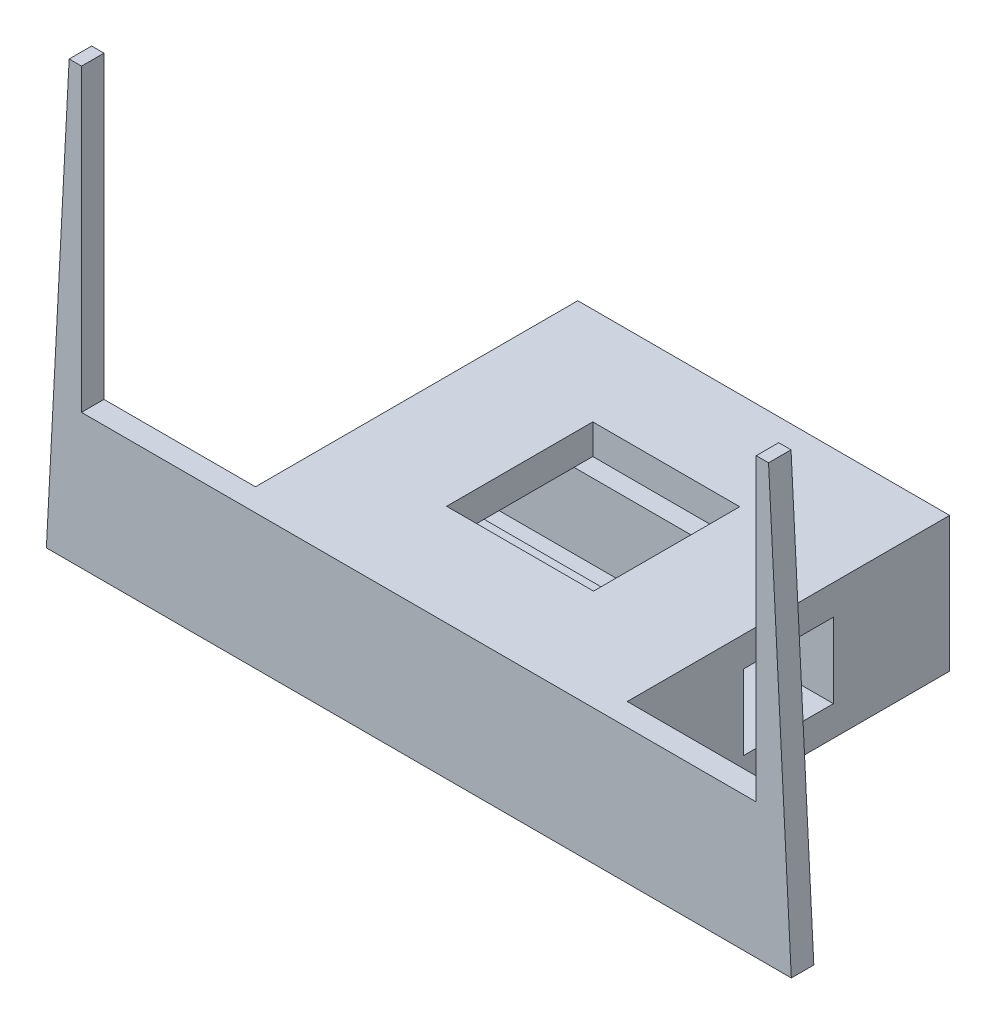
ISO-10303-21;
HEADER;
FILE_DESCRIPTION(('STEP AP214'),'2;1');
FILE_NAME('part.step','',(''),(''),'','','');
FILE_SCHEMA(('AUTOMOTIVE_DESIGN { 1 0 10303 214 1 1 1 1 }'));
ENDSEC;
DATA;
#1=APPLICATION_CONTEXT('core data for automotive mechanical design processes');
#2=APPLICATION_PROTOCOL_DEFINITION('international standard','automotive_design',2000,#1);
#3=PRODUCT_CONTEXT('',#1,'mechanical');
#4=PRODUCT('Part','Part','',(#3));
#5=PRODUCT_RELATED_PRODUCT_CATEGORY('part','',(#4));
#6=PRODUCT_DEFINITION_FORMATION('','',#4);
#7=PRODUCT_DEFINITION_CONTEXT('part definition',#1,'design');
#8=PRODUCT_DEFINITION('design','',#6,#7);
#9=PRODUCT_DEFINITION_SHAPE('','',#8);
#10=(LENGTH_UNIT() NAMED_UNIT(*) SI_UNIT(.MILLI.,.METRE.));
#11=(NAMED_UNIT(*) PLANE_ANGLE_UNIT() SI_UNIT($,.RADIAN.));
#12=(NAMED_UNIT(*) SI_UNIT($,.STERADIAN.) SOLID_ANGLE_UNIT());
#13=UNCERTAINTY_MEASURE_WITH_UNIT(LENGTH_MEASURE(1.E-05),#10,'distance_accuracy_value','');
#14=(GEOMETRIC_REPRESENTATION_CONTEXT(3) GLOBAL_UNCERTAINTY_ASSIGNED_CONTEXT((#13)) GLOBAL_UNIT_ASSIGNED_CONTEXT((#10,
#11,#12)) REPRESENTATION_CONTEXT('',''));
#15=CARTESIAN_POINT('',(0.,0.,0.));
#16=DIRECTION('',(0.,0.,1.));
#17=DIRECTION('',(1.,0.,0.));
#18=AXIS2_PLACEMENT_3D('',#15,#16,#17);
#19=CARTESIAN_POINT('',(-49.011468782096,126.446827243752,26.7908140059585));
#20=DIRECTION('',(1.,0.,0.));
#21=DIRECTION('',(0.,0.,-1.));
#22=AXIS2_PLACEMENT_3D('',#19,#20,#21);
#23=PLANE('',#22);
#24=DIRECTION('',(0.,1.,0.));
#25=VECTOR('',#24,1.);
#26=CARTESIAN_POINT('',(-49.011468782096,126.446827243752,-24.2091859940415));
#27=LINE('',#26,#25);
#28=CARTESIAN_POINT('',(-49.011468782096,-15.9745289935572,-24.2091859940415));
#29=VERTEX_POINT('',#28);
#30=CARTESIAN_POINT('',(-49.011468782096,24.0254710064428,-24.2091859940415));
#31=VERTEX_POINT('',#30);
#32=EDGE_CURVE('E244',#29,#31,#27,.T.);
#33=ORIENTED_EDGE('',*,*,#32,.F.);
#34=DIRECTION('',(0.,0.,-1.));
#35=VECTOR('',#34,1.);
#36=CARTESIAN_POINT('',(-49.011468782096,-15.9745289935572,-27.2091859940415));
#37=LINE('',#36,#35);
#38=CARTESIAN_POINT('',(-49.011468782096,-15.9745289935572,-27.2091859940415));
#39=VERTEX_POINT('',#38);
#40=EDGE_CURVE('E217',#29,#39,#37,.T.);
#41=ORIENTED_EDGE('',*,*,#40,.T.);
#42=DIRECTION('',(0.,-1.,0.));
#43=VECTOR('',#42,1.);
#44=CARTESIAN_POINT('',(-49.011468782096,24.0254710064428,-27.2091859940415));
#45=LINE('',#44,#43);
#46=CARTESIAN_POINT('',(-49.011468782096,24.0254710064428,-27.2091859940415));
#47=VERTEX_POINT('',#46);
#48=EDGE_CURVE('E328',#47,#39,#45,.T.);
#49=ORIENTED_EDGE('',*,*,#48,.F.);
#50=DIRECTION('',(0.,0.,1.));
#51=VECTOR('',#50,1.);
#52=CARTESIAN_POINT('',(-49.011468782096,24.0254710064428,-45.2091859940415));
#53=LINE('',#52,#51);
#54=EDGE_CURVE('E213',#47,#31,#53,.T.);
#55=ORIENTED_EDGE('',*,*,#54,.T.);
#56=EDGE_LOOP('',(#33,#41,#49,#55));
#57=FACE_BOUND('',#56,.T.);
#58=ADVANCED_FACE('F41',(#57),#23,.T.);
#59=CARTESIAN_POINT('',(40.988531217904,126.446827243752,26.7908140059585));
#60=DIRECTION('',(-1.,0.,0.));
#61=DIRECTION('',(0.,0.,1.));
#62=AXIS2_PLACEMENT_3D('',#59,#60,#61);
#63=PLANE('',#62);
#64=DIRECTION('',(0.,-1.,0.));
#65=VECTOR('',#64,1.);
#66=CARTESIAN_POINT('',(40.988531217904,126.446827243752,-24.2091859940415));
#67=LINE('',#66,#65);
#68=CARTESIAN_POINT('',(40.988531217904,24.0254710064428,-24.2091859940415));
#69=VERTEX_POINT('',#68);
#70=CARTESIAN_POINT('',(40.988531217904,-15.9745289935572,-24.2091859940415));
#71=VERTEX_POINT('',#70);
#72=EDGE_CURVE('E246',#69,#71,#67,.T.);
#73=ORIENTED_EDGE('',*,*,#72,.F.);
#74=DIRECTION('',(0.,0.,-1.));
#75=VECTOR('',#74,1.);
#76=CARTESIAN_POINT('',(40.988531217904,24.0254710064428,21.7908140059585));
#77=LINE('',#76,#75);
#78=CARTESIAN_POINT('',(40.988531217904,24.0254710064428,-27.2091859940415));
#79=VERTEX_POINT('',#78);
#80=EDGE_CURVE('E216',#69,#79,#77,.T.);
#81=ORIENTED_EDGE('',*,*,#80,.T.);
#82=DIRECTION('',(0.,1.,0.));
#83=VECTOR('',#82,1.);
#84=CARTESIAN_POINT('',(40.988531217904,-29.9745289935572,-27.2091859940415));
#85=LINE('',#84,#83);
#86=CARTESIAN_POINT('',(40.988531217904,-15.9745289935572,-27.2091859940415));
#87=VERTEX_POINT('',#86);
#88=EDGE_CURVE('E222',#87,#79,#85,.T.);
#89=ORIENTED_EDGE('',*,*,#88,.F.);
#90=DIRECTION('',(0.,0.,1.));
#91=VECTOR('',#90,1.);
#92=CARTESIAN_POINT('',(40.988531217904,-15.9745289935572,-27.2091859940415));
#93=LINE('',#92,#91);
#94=EDGE_CURVE('E210',#87,#71,#93,.T.);
#95=ORIENTED_EDGE('',*,*,#94,.T.);
#96=EDGE_LOOP('',(#73,#81,#89,#95));
#97=FACE_BOUND('',#96,.T.);
#98=ADVANCED_FACE('F386',(#97),#63,.T.);
#99=CARTESIAN_POINT('',(-39.011468782096,24.0254710064428,-45.2091859940415));
#100=DIRECTION('',(0.,1.,0.));
#101=DIRECTION('',(0.,0.,1.));
#102=AXIS2_PLACEMENT_3D('',#99,#100,#101);
#103=PLANE('',#102);
#104=DIRECTION('',(-1.,0.,0.));
#105=VECTOR('',#104,1.);
#106=CARTESIAN_POINT('',(-53.6970221063976,24.0254710064428,-24.2091859940415));
#107=LINE('',#106,#105);
#108=CARTESIAN_POINT('',(-50.6573709079813,24.0254710064428,-24.2091859940415));
#109=VERTEX_POINT('',#108);
#110=EDGE_CURVE('E52',#31,#109,#107,.T.);
#111=ORIENTED_EDGE('',*,*,#110,.F.);
#112=ORIENTED_EDGE('',*,*,#54,.F.);
#113=DIRECTION('',(1.,0.,0.));
#114=VECTOR('',#113,1.);
#115=CARTESIAN_POINT('',(-50.6573709079813,24.0254710064428,-27.2091859940415));
#116=LINE('',#115,#114);
#117=CARTESIAN_POINT('',(-50.6573709079813,24.0254710064428,-27.2091859940415));
#118=VERTEX_POINT('',#117);
#119=EDGE_CURVE('E355',#118,#47,#116,.T.);
#120=ORIENTED_EDGE('',*,*,#119,.F.);
#121=DIRECTION('',(0.,0.,1.));
#122=VECTOR('',#121,1.);
#123=CARTESIAN_POINT('',(-50.6573709079813,24.0254710064428,24.7908140059585));
#124=LINE('',#123,#122);
#125=EDGE_CURVE('E205',#118,#109,#124,.T.);
#126=ORIENTED_EDGE('',*,*,#125,.T.);
#127=EDGE_LOOP('',(#111,#112,#120,#126));
#128=FACE_BOUND('',#127,.T.);
#129=ADVANCED_FACE('F389',(#128),#103,.T.);
#130=CARTESIAN_POINT('',(42.6344333437893,24.0254710064428,-24.2091859940415));
#131=VERTEX_POINT('',#130);
#132=EDGE_CURVE('E11',#131,#69,#107,.T.);
#133=ORIENTED_EDGE('',*,*,#132,.F.);
#134=DIRECTION('',(0.,0.,-1.));
#135=VECTOR('',#134,1.);
#136=CARTESIAN_POINT('',(42.6344333437893,24.0254710064428,-45.2091859940415));
#137=LINE('',#136,#135);
#138=CARTESIAN_POINT('',(42.6344333437893,24.0254710064428,-27.2091859940415));
#139=VERTEX_POINT('',#138);
#140=EDGE_CURVE('E199',#131,#139,#137,.T.);
#141=ORIENTED_EDGE('',*,*,#140,.T.);
#142=DIRECTION('',(1.,0.,0.));
#143=VECTOR('',#142,1.);
#144=CARTESIAN_POINT('',(40.988531217904,24.0254710064428,-27.2091859940415));
#145=LINE('',#144,#143);
#146=EDGE_CURVE('E227',#79,#139,#145,.T.);
#147=ORIENTED_EDGE('',*,*,#146,.F.);
#148=ORIENTED_EDGE('',*,*,#80,.F.);
#149=EDGE_LOOP('',(#133,#141,#147,#148));
#150=FACE_BOUND('',#149,.T.);
#151=ADVANCED_FACE('F384',(#150),#103,.T.);
#152=CARTESIAN_POINT('',(-50.6573709079813,24.0254710064428,-45.2091859940415));
#153=DIRECTION('',(-0.998629534754574,0.0523359562429415,0.));
#154=DIRECTION('',(0.,0.,-1.));
#155=AXIS2_PLACEMENT_3D('',#152,#153,#154);
#156=PLANE('',#155);
#157=DIRECTION('',(-0.0523359562429415,-0.998629534754574,0.));
#158=VECTOR('',#157,1.);
#159=CARTESIAN_POINT('',(-50.6573709079813,24.0254710064428,-24.2091859940415));
#160=LINE('',#159,#158);
#161=CARTESIAN_POINT('',(-53.6970221063976,-33.9745289935572,-24.2091859940415));
#162=VERTEX_POINT('',#161);
#163=EDGE_CURVE('E184',#109,#162,#160,.T.);
#164=ORIENTED_EDGE('',*,*,#163,.F.);
#165=ORIENTED_EDGE('',*,*,#125,.F.);
#166=DIRECTION('',(0.0523359562429415,0.998629534754574,0.));
#167=VECTOR('',#166,1.);
#168=CARTESIAN_POINT('',(-53.6970221063976,-33.9745289935572,-27.2091859940415));
#169=LINE('',#168,#167);
#170=CARTESIAN_POINT('',(-53.6970221063976,-33.9745289935572,-27.2091859940415));
#171=VERTEX_POINT('',#170);
#172=EDGE_CURVE('E352',#171,#118,#169,.T.);
#173=ORIENTED_EDGE('',*,*,#172,.F.);
#174=DIRECTION('',(0.,0.,-1.));
#175=VECTOR('',#174,1.);
#176=CARTESIAN_POINT('',(-53.6970221063976,-33.9745289935572,-45.2091859940415));
#177=LINE('',#176,#175);
#178=EDGE_CURVE('E192',#162,#171,#177,.T.);
#179=ORIENTED_EDGE('',*,*,#178,.F.);
#180=EDGE_LOOP('',(#164,#165,#173,#179));
#181=FACE_BOUND('',#180,.T.);
#182=ADVANCED_FACE('F399',(#181),#156,.T.);
#183=CARTESIAN_POINT('',(42.6344333437893,24.0254710064428,-45.2091859940415));
#184=DIRECTION('',(0.998629534754574,0.0523359562429415,0.));
#185=DIRECTION('',(0.,0.,1.));
#186=AXIS2_PLACEMENT_3D('',#183,#184,#185);
#187=PLANE('',#186);
#188=DIRECTION('',(-0.0523359562429415,0.998629534754574,0.));
#189=VECTOR('',#188,1.);
#190=CARTESIAN_POINT('',(42.6344333437893,24.0254710064428,-24.2091859940415));
#191=LINE('',#190,#189);
#192=CARTESIAN_POINT('',(45.6740845422055,-33.9745289935572,-24.2091859940415));
#193=VERTEX_POINT('',#192);
#194=EDGE_CURVE('E50',#193,#131,#191,.T.);
#195=ORIENTED_EDGE('',*,*,#194,.F.);
#196=DIRECTION('',(0.,0.,1.));
#197=VECTOR('',#196,1.);
#198=CARTESIAN_POINT('',(45.6740845422055,-33.9745289935572,-45.2091859940415));
#199=LINE('',#198,#197);
#200=CARTESIAN_POINT('',(45.6740845422055,-33.9745289935572,-27.2091859940415));
#201=VERTEX_POINT('',#200);
#202=EDGE_CURVE('E44',#201,#193,#199,.T.);
#203=ORIENTED_EDGE('',*,*,#202,.F.);
#204=DIRECTION('',(0.0523359562429415,-0.998629534754574,0.));
#205=VECTOR('',#204,1.);
#206=CARTESIAN_POINT('',(42.6344333437893,24.0254710064428,-27.2091859940415));
#207=LINE('',#206,#205);
#208=EDGE_CURVE('E349',#139,#201,#207,.T.);
#209=ORIENTED_EDGE('',*,*,#208,.F.);
#210=ORIENTED_EDGE('',*,*,#140,.F.);
#211=EDGE_LOOP('',(#195,#203,#209,#210));
#212=FACE_BOUND('',#211,.T.);
#213=ADVANCED_FACE('F196',(#212),#187,.T.);
#214=CARTESIAN_POINT('',(-54.011468782096,-33.9745289935572,-50.2091859940415));
#215=DIRECTION('',(0.,1.,0.));
#216=DIRECTION('',(0.,0.,1.));
#217=AXIS2_PLACEMENT_3D('',#214,#215,#216);
#218=PLANE('',#217);
#219=ORIENTED_EDGE('',*,*,#202,.T.);
#220=DIRECTION('',(-1.,0.,0.));
#221=VECTOR('',#220,1.);
#222=CARTESIAN_POINT('',(-53.6970221063976,-33.9745289935572,-24.2091859940415));
#223=LINE('',#222,#221);
#224=EDGE_CURVE('E186',#193,#162,#223,.T.);
#225=ORIENTED_EDGE('',*,*,#224,.T.);
#226=ORIENTED_EDGE('',*,*,#178,.T.);
#227=DIRECTION('',(-1.,0.,0.));
#228=VECTOR('',#227,1.);
#229=CARTESIAN_POINT('',(45.6740845422055,-33.9745289935572,-27.2091859940415));
#230=LINE('',#229,#228);
#231=CARTESIAN_POINT('',(-28.811468782096,-33.9745289935572,-27.2091859940415));
#232=VERTEX_POINT('',#231);
#233=EDGE_CURVE('E240',#232,#171,#230,.T.);
#234=ORIENTED_EDGE('',*,*,#233,.F.);
#235=DIRECTION('',(0.,0.,1.));
#236=VECTOR('',#235,1.);
#237=CARTESIAN_POINT('',(-28.811468782096,-33.9745289935572,-70.2091859940415));
#238=LINE('',#237,#236);
#239=CARTESIAN_POINT('',(-28.811468782096,-33.9745289935572,-70.2091859940415));
#240=VERTEX_POINT('',#239);
#241=EDGE_CURVE('E310',#240,#232,#238,.T.);
#242=ORIENTED_EDGE('',*,*,#241,.F.);
#243=DIRECTION('',(-1.,0.,0.));
#244=VECTOR('',#243,1.);
#245=CARTESIAN_POINT('',(-54.011468782096,-33.9745289935572,-70.2091859940415));
#246=LINE('',#245,#244);
#247=CARTESIAN_POINT('',(20.788531217904,-33.9745289935572,-70.2091859940415));
#248=VERTEX_POINT('',#247);
#249=EDGE_CURVE('E236',#248,#240,#246,.T.);
#250=ORIENTED_EDGE('',*,*,#249,.F.);
#251=DIRECTION('',(0.,0.,-1.));
#252=VECTOR('',#251,1.);
#253=CARTESIAN_POINT('',(20.788531217904,-33.9745289935572,-70.2091859940415));
#254=LINE('',#253,#252);
#255=CARTESIAN_POINT('',(20.788531217904,-33.9745289935572,-27.2091859940415));
#256=VERTEX_POINT('',#255);
#257=EDGE_CURVE('E266',#256,#248,#254,.T.);
#258=ORIENTED_EDGE('',*,*,#257,.F.);
#259=EDGE_CURVE('E204',#201,#256,#230,.T.);
#260=ORIENTED_EDGE('',*,*,#259,.F.);
#261=EDGE_LOOP('',(#219,#225,#226,#234,#242,#250,#258,#260));
#262=FACE_BOUND('',#261,.T.);
#263=ADVANCED_FACE('F202',(#262),#218,.F.);
#264=CARTESIAN_POINT('',(-4.01146878209603,-39.9745289935572,-27.2091859940415));
#265=DIRECTION('',(0.,0.,-1.));
#266=DIRECTION('',(-1.,0.,0.));
#267=AXIS2_PLACEMENT_3D('',#264,#265,#266);
#268=PLANE('',#267);
#269=DIRECTION('',(1.,0.,0.));
#270=VECTOR('',#269,1.);
#271=CARTESIAN_POINT('',(40.988531217904,-15.9745289935572,-27.2091859940415));
#272=LINE('',#271,#270);
#273=CARTESIAN_POINT('',(20.7885312179039,-15.9745289935572,-27.2091859940415));
#274=VERTEX_POINT('',#273);
#275=EDGE_CURVE('E218',#274,#87,#272,.T.);
#276=ORIENTED_EDGE('',*,*,#275,.T.);
#277=ORIENTED_EDGE('',*,*,#88,.T.);
#278=ORIENTED_EDGE('',*,*,#146,.T.);
#279=ORIENTED_EDGE('',*,*,#208,.T.);
#280=ORIENTED_EDGE('',*,*,#259,.T.);
#281=DIRECTION('',(0.,1.,0.));
#282=VECTOR('',#281,1.);
#283=CARTESIAN_POINT('',(20.788531217904,-39.9745289935572,-27.2091859940415));
#284=LINE('',#283,#282);
#285=EDGE_CURVE('E241',#256,#274,#284,.T.);
#286=ORIENTED_EDGE('',*,*,#285,.T.);
#287=EDGE_LOOP('',(#276,#277,#278,#279,#280,#286));
#288=FACE_BOUND('',#287,.T.);
#289=ADVANCED_FACE('F382',(#288),#268,.T.);
#290=DIRECTION('',(1.,0.,0.));
#291=VECTOR('',#290,1.);
#292=CARTESIAN_POINT('',(-28.811468782096,-15.9745289935572,-27.2091859940415));
#293=LINE('',#292,#291);
#294=CARTESIAN_POINT('',(-28.811468782096,-15.9745289935572,-27.2091859940415));
#295=VERTEX_POINT('',#294);
#296=EDGE_CURVE('E237',#39,#295,#293,.T.);
#297=ORIENTED_EDGE('',*,*,#296,.T.);
#298=DIRECTION('',(0.,1.,0.));
#299=VECTOR('',#298,1.);
#300=CARTESIAN_POINT('',(-28.811468782096,-39.9745289935572,-27.2091859940415));
#301=LINE('',#300,#299);
#302=EDGE_CURVE('E260',#232,#295,#301,.T.);
#303=ORIENTED_EDGE('',*,*,#302,.F.);
#304=ORIENTED_EDGE('',*,*,#233,.T.);
#305=ORIENTED_EDGE('',*,*,#172,.T.);
#306=ORIENTED_EDGE('',*,*,#119,.T.);
#307=ORIENTED_EDGE('',*,*,#48,.T.);
#308=EDGE_LOOP('',(#297,#303,#304,#305,#306,#307));
#309=FACE_BOUND('',#308,.T.);
#310=ADVANCED_FACE('F362',(#309),#268,.T.);
#311=CARTESIAN_POINT('',(-28.811468782096,49.3008062076875,-57.2091859940415));
#312=DIRECTION('',(0.,0.,-1.));
#313=DIRECTION('',(-1.,0.,0.));
#314=AXIS2_PLACEMENT_3D('',#311,#312,#313);
#315=PLANE('',#314);
#316=DIRECTION('',(0.,1.,0.));
#317=VECTOR('',#316,1.);
#318=CARTESIAN_POINT('',(5.78853121790398,-19.9745289935572,-57.2091859940415));
#319=LINE('',#318,#317);
#320=CARTESIAN_POINT('',(5.78853121790398,-19.9745289935572,-57.2091859940415));
#321=VERTEX_POINT('',#320);
#322=CARTESIAN_POINT('',(5.78853121790398,-15.9745289935572,-57.2091859940415));
#323=VERTEX_POINT('',#322);
#324=EDGE_CURVE('E325',#321,#323,#319,.T.);
#325=ORIENTED_EDGE('',*,*,#324,.T.);
#326=DIRECTION('',(-1.,0.,0.));
#327=VECTOR('',#326,1.);
#328=CARTESIAN_POINT('',(-28.811468782096,-15.9745289935572,-57.2091859940415));
#329=LINE('',#328,#327);
#330=CARTESIAN_POINT('',(-13.811468782096,-15.9745289935572,-57.2091859940415));
#331=VERTEX_POINT('',#330);
#332=EDGE_CURVE('E324',#323,#331,#329,.T.);
#333=ORIENTED_EDGE('',*,*,#332,.T.);
#334=DIRECTION('',(0.,-1.,0.));
#335=VECTOR('',#334,1.);
#336=CARTESIAN_POINT('',(-13.811468782096,-14.9745289935572,-57.2091859940415));
#337=LINE('',#336,#335);
#338=CARTESIAN_POINT('',(-13.811468782096,-19.9745289935572,-57.2091859940415));
#339=VERTEX_POINT('',#338);
#340=EDGE_CURVE('E322',#331,#339,#337,.T.);
#341=ORIENTED_EDGE('',*,*,#340,.T.);
#342=DIRECTION('',(1.,0.,0.));
#343=VECTOR('',#342,1.);
#344=CARTESIAN_POINT('',(-13.811468782096,-19.9745289935572,-57.2091859940415));
#345=LINE('',#344,#343);
#346=EDGE_CURVE('E319',#339,#321,#345,.T.);
#347=ORIENTED_EDGE('',*,*,#346,.T.);
#348=EDGE_LOOP('',(#325,#333,#341,#347));
#349=FACE_BOUND('',#348,.T.);
#350=ADVANCED_FACE('F432',(#349),#315,.F.);
#351=CARTESIAN_POINT('',(-4.01146878209604,-19.9745289935572,-30.2091859940415));
#352=DIRECTION('',(0.,1.,0.));
#353=DIRECTION('',(0.,0.,1.));
#354=AXIS2_PLACEMENT_3D('',#351,#352,#353);
#355=PLANE('',#354);
#356=DIRECTION('',(0.,0.,1.));
#357=VECTOR('',#356,1.);
#358=CARTESIAN_POINT('',(5.78853121790398,-19.9745289935572,-59.7091859940415));
#359=LINE('',#358,#357);
#360=CARTESIAN_POINT('',(5.78853121790398,-19.9745289935572,-54.7091859940415));
#361=VERTEX_POINT('',#360);
#362=EDGE_CURVE('E315',#321,#361,#359,.T.);
#363=ORIENTED_EDGE('',*,*,#362,.F.);
#364=ORIENTED_EDGE('',*,*,#346,.F.);
#365=DIRECTION('',(0.,0.,-1.));
#366=VECTOR('',#365,1.);
#367=CARTESIAN_POINT('',(-13.811468782096,-19.9745289935572,-59.7091859940415));
#368=LINE('',#367,#366);
#369=CARTESIAN_POINT('',(-13.811468782096,-19.9745289935572,-54.7091859940415));
#370=VERTEX_POINT('',#369);
#371=EDGE_CURVE('E307',#370,#339,#368,.T.);
#372=ORIENTED_EDGE('',*,*,#371,.F.);
#373=DIRECTION('',(1.,0.,0.));
#374=VECTOR('',#373,1.);
#375=CARTESIAN_POINT('',(-28.811468782096,-19.9745289935572,-54.7091859940415));
#376=LINE('',#375,#374);
#377=EDGE_CURVE('E288',#370,#361,#376,.T.);
#378=ORIENTED_EDGE('',*,*,#377,.T.);
#379=EDGE_LOOP('',(#363,#364,#372,#378));
#380=FACE_BOUND('',#379,.T.);
#381=ADVANCED_FACE('F428',(#380),#355,.T.);
#382=CARTESIAN_POINT('',(-13.811468782096,-14.9745289935572,-59.7091859940415));
#383=DIRECTION('',(-1.,0.,0.));
#384=DIRECTION('',(0.,0.,1.));
#385=AXIS2_PLACEMENT_3D('',#382,#383,#384);
#386=PLANE('',#385);
#387=ORIENTED_EDGE('',*,*,#340,.F.);
#388=DIRECTION('',(0.,0.,1.));
#389=VECTOR('',#388,1.);
#390=CARTESIAN_POINT('',(-13.811468782096,-15.9745289935572,-59.7091859940415));
#391=LINE('',#390,#389);
#392=CARTESIAN_POINT('',(-13.811468782096,-15.9745289935572,-37.7091859940415));
#393=VERTEX_POINT('',#392);
#394=EDGE_CURVE('E303',#331,#393,#391,.T.);
#395=ORIENTED_EDGE('',*,*,#394,.T.);
#396=DIRECTION('',(0.,-1.,0.));
#397=VECTOR('',#396,1.);
#398=CARTESIAN_POINT('',(-13.811468782096,-14.9745289935572,-37.7091859940415));
#399=LINE('',#398,#397);
#400=CARTESIAN_POINT('',(-13.811468782096,-19.9745289935572,-37.7091859940415));
#401=VERTEX_POINT('',#400);
#402=EDGE_CURVE('E300',#393,#401,#399,.T.);
#403=ORIENTED_EDGE('',*,*,#402,.T.);
#404=CARTESIAN_POINT('',(-13.811468782096,-19.9745289935572,-42.7091859940415));
#405=VERTEX_POINT('',#404);
#406=EDGE_CURVE('E302',#401,#405,#368,.T.);
#407=ORIENTED_EDGE('',*,*,#406,.T.);
#408=EDGE_CURVE('E306',#405,#370,#368,.T.);
#409=ORIENTED_EDGE('',*,*,#408,.T.);
#410=ORIENTED_EDGE('',*,*,#371,.T.);
#411=EDGE_LOOP('',(#387,#395,#403,#407,#409,#410));
#412=FACE_BOUND('',#411,.T.);
#413=ADVANCED_FACE('F431',(#412),#386,.F.);
#414=CARTESIAN_POINT('',(5.78853121790398,-14.9745289935572,-59.7091859940415));
#415=DIRECTION('',(1.,0.,0.));
#416=DIRECTION('',(0.,0.,-1.));
#417=AXIS2_PLACEMENT_3D('',#414,#415,#416);
#418=PLANE('',#417);
#419=DIRECTION('',(0.,-1.,0.));
#420=VECTOR('',#419,1.);
#421=CARTESIAN_POINT('',(5.78853121790398,-14.9745289935572,-37.7091859940415));
#422=LINE('',#421,#420);
#423=CARTESIAN_POINT('',(5.78853121790398,-15.9745289935572,-37.7091859940415));
#424=VERTEX_POINT('',#423);
#425=CARTESIAN_POINT('',(5.78853121790398,-19.9745289935572,-37.7091859940415));
#426=VERTEX_POINT('',#425);
#427=EDGE_CURVE('E235',#424,#426,#422,.T.);
#428=ORIENTED_EDGE('',*,*,#427,.F.);
#429=DIRECTION('',(0.,0.,-1.));
#430=VECTOR('',#429,1.);
#431=CARTESIAN_POINT('',(5.78853121790398,-15.9745289935572,-59.7091859940415));
#432=LINE('',#431,#430);
#433=EDGE_CURVE('E317',#424,#323,#432,.T.);
#434=ORIENTED_EDGE('',*,*,#433,.T.);
#435=ORIENTED_EDGE('',*,*,#324,.F.);
#436=ORIENTED_EDGE('',*,*,#362,.T.);
#437=CARTESIAN_POINT('',(5.78853121790398,-19.9745289935572,-42.7091859940415));
#438=VERTEX_POINT('',#437);
#439=EDGE_CURVE('E316',#361,#438,#359,.T.);
#440=ORIENTED_EDGE('',*,*,#439,.T.);
#441=EDGE_CURVE('E292',#438,#426,#359,.T.);
#442=ORIENTED_EDGE('',*,*,#441,.T.);
#443=EDGE_LOOP('',(#428,#434,#435,#436,#440,#442));
#444=FACE_BOUND('',#443,.T.);
#445=ADVANCED_FACE('F437',(#444),#418,.F.);
#446=CARTESIAN_POINT('',(-4.01146878209604,-19.9745289935572,-30.2091859940415));
#447=DIRECTION('',(0.,1.,0.));
#448=DIRECTION('',(0.,0.,1.));
#449=AXIS2_PLACEMENT_3D('',#446,#447,#448);
#450=PLANE('',#449);
#451=DIRECTION('',(1.,0.,0.));
#452=VECTOR('',#451,1.);
#453=CARTESIAN_POINT('',(-28.811468782096,-19.9745289935572,-37.7091859940415));
#454=LINE('',#453,#452);
#455=EDGE_CURVE('E289',#401,#426,#454,.T.);
#456=ORIENTED_EDGE('',*,*,#455,.T.);
#457=ORIENTED_EDGE('',*,*,#441,.F.);
#458=DIRECTION('',(-1.,0.,0.));
#459=VECTOR('',#458,1.);
#460=CARTESIAN_POINT('',(-28.811468782096,-19.9745289935572,-42.7091859940415));
#461=LINE('',#460,#459);
#462=EDGE_CURVE('E291',#438,#405,#461,.T.);
#463=ORIENTED_EDGE('',*,*,#462,.T.);
#464=ORIENTED_EDGE('',*,*,#406,.F.);
#465=EDGE_LOOP('',(#456,#457,#463,#464));
#466=FACE_BOUND('',#465,.T.);
#467=ADVANCED_FACE('F434',(#466),#450,.T.);
#468=CARTESIAN_POINT('',(-39.011468782096,-29.9745289935572,-65.2091859940415));
#469=DIRECTION('',(0.,-1.,0.));
#470=DIRECTION('',(0.,0.,-1.));
#471=AXIS2_PLACEMENT_3D('',#468,#469,#470);
#472=PLANE('',#471);
#473=DIRECTION('',(-1.,0.,0.));
#474=VECTOR('',#473,1.);
#475=CARTESIAN_POINT('',(-28.811468782096,-29.9745289935572,-42.7091859940415));
#476=LINE('',#475,#474);
#477=CARTESIAN_POINT('',(20.788531217904,-29.9745289935572,-42.7091859940415));
#478=VERTEX_POINT('',#477);
#479=CARTESIAN_POINT('',(-28.811468782096,-29.9745289935572,-42.7091859940415));
#480=VERTEX_POINT('',#479);
#481=EDGE_CURVE('E278',#478,#480,#476,.T.);
#482=ORIENTED_EDGE('',*,*,#481,.F.);
#483=DIRECTION('',(0.,0.,1.));
#484=VECTOR('',#483,1.);
#485=CARTESIAN_POINT('',(20.788531217904,-29.9745289935572,-70.2091859940415));
#486=LINE('',#485,#484);
#487=CARTESIAN_POINT('',(20.788531217904,-29.9745289935572,-54.7091859940415));
#488=VERTEX_POINT('',#487);
#489=EDGE_CURVE('E257',#488,#478,#486,.T.);
#490=ORIENTED_EDGE('',*,*,#489,.F.);
#491=DIRECTION('',(1.,0.,0.));
#492=VECTOR('',#491,1.);
#493=CARTESIAN_POINT('',(-28.811468782096,-29.9745289935572,-54.7091859940415));
#494=LINE('',#493,#492);
#495=CARTESIAN_POINT('',(-28.811468782096,-29.9745289935572,-54.7091859940415));
#496=VERTEX_POINT('',#495);
#497=EDGE_CURVE('E273',#496,#488,#494,.T.);
#498=ORIENTED_EDGE('',*,*,#497,.F.);
#499=DIRECTION('',(0.,0.,-1.));
#500=VECTOR('',#499,1.);
#501=CARTESIAN_POINT('',(-28.811468782096,-29.9745289935572,-70.2091859940415));
#502=LINE('',#501,#500);
#503=EDGE_CURVE('E271',#480,#496,#502,.T.);
#504=ORIENTED_EDGE('',*,*,#503,.F.);
#505=EDGE_LOOP('',(#482,#490,#498,#504));
#506=FACE_BOUND('',#505,.T.);
#507=ADVANCED_FACE('F420',(#506),#472,.F.);
#508=CARTESIAN_POINT('',(20.788531217904,-39.9745289935572,-70.2091859940415));
#509=DIRECTION('',(-1.,0.,0.));
#510=DIRECTION('',(0.,0.,1.));
#511=AXIS2_PLACEMENT_3D('',#508,#509,#510);
#512=PLANE('',#511);
#513=DIRECTION('',(0.,0.,1.));
#514=VECTOR('',#513,1.);
#515=CARTESIAN_POINT('',(20.788531217904,-15.9745289935572,-70.2091859940415));
#516=LINE('',#515,#514);
#517=CARTESIAN_POINT('',(20.788531217904,-15.9745289935572,-70.2091859940415));
#518=VERTEX_POINT('',#517);
#519=EDGE_CURVE('E334',#518,#274,#516,.T.);
#520=ORIENTED_EDGE('',*,*,#519,.T.);
#521=ORIENTED_EDGE('',*,*,#285,.F.);
#522=ORIENTED_EDGE('',*,*,#257,.T.);
#523=DIRECTION('',(0.,1.,0.));
#524=VECTOR('',#523,1.);
#525=CARTESIAN_POINT('',(20.788531217904,-39.9745289935572,-70.2091859940415));
#526=LINE('',#525,#524);
#527=EDGE_CURVE('E262',#248,#518,#526,.T.);
#528=ORIENTED_EDGE('',*,*,#527,.T.);
#529=EDGE_LOOP('',(#520,#521,#522,#528));
#530=FACE_BOUND('',#529,.T.);
#531=DIRECTION('',(0.,0.,-1.));
#532=VECTOR('',#531,1.);
#533=CARTESIAN_POINT('',(20.788531217904,-19.9745289935572,-59.7091859940415));
#534=LINE('',#533,#532);
#535=CARTESIAN_POINT('',(20.788531217904,-19.9745289935572,-42.7091859940415));
#536=VERTEX_POINT('',#535);
#537=CARTESIAN_POINT('',(20.788531217904,-19.9745289935572,-54.7091859940415));
#538=VERTEX_POINT('',#537);
#539=EDGE_CURVE('E265',#536,#538,#534,.T.);
#540=ORIENTED_EDGE('',*,*,#539,.T.);
#541=DIRECTION('',(0.,-1.,0.));
#542=VECTOR('',#541,1.);
#543=CARTESIAN_POINT('',(20.788531217904,-19.9745289935572,-54.7091859940415));
#544=LINE('',#543,#542);
#545=EDGE_CURVE('E261',#538,#488,#544,.T.);
#546=ORIENTED_EDGE('',*,*,#545,.T.);
#547=ORIENTED_EDGE('',*,*,#489,.T.);
#548=DIRECTION('',(0.,-1.,0.));
#549=VECTOR('',#548,1.);
#550=CARTESIAN_POINT('',(20.788531217904,-19.9745289935572,-42.7091859940415));
#551=LINE('',#550,#549);
#552=EDGE_CURVE('E287',#536,#478,#551,.T.);
#553=ORIENTED_EDGE('',*,*,#552,.F.);
#554=EDGE_LOOP('',(#540,#546,#547,#553));
#555=FACE_BOUND('',#554,.T.);
#556=ADVANCED_FACE('F379',(#530,#555),#512,.F.);
#557=CARTESIAN_POINT('',(-28.811468782096,-39.9745289935572,-70.2091859940415));
#558=DIRECTION('',(1.,0.,0.));
#559=DIRECTION('',(0.,0.,-1.));
#560=AXIS2_PLACEMENT_3D('',#557,#558,#559);
#561=PLANE('',#560);
#562=ORIENTED_EDGE('',*,*,#302,.T.);
#563=DIRECTION('',(0.,0.,-1.));
#564=VECTOR('',#563,1.);
#565=CARTESIAN_POINT('',(-28.811468782096,-15.9745289935572,-70.2091859940415));
#566=LINE('',#565,#564);
#567=CARTESIAN_POINT('',(-28.8114687820961,-15.9745289935572,-70.2091859940415));
#568=VERTEX_POINT('',#567);
#569=EDGE_CURVE('E331',#295,#568,#566,.T.);
#570=ORIENTED_EDGE('',*,*,#569,.T.);
#571=DIRECTION('',(0.,1.,0.));
#572=VECTOR('',#571,1.);
#573=CARTESIAN_POINT('',(-28.811468782096,-39.9745289935572,-70.2091859940415));
#574=LINE('',#573,#572);
#575=EDGE_CURVE('E267',#240,#568,#574,.T.);
#576=ORIENTED_EDGE('',*,*,#575,.F.);
#577=ORIENTED_EDGE('',*,*,#241,.T.);
#578=EDGE_LOOP('',(#562,#570,#576,#577));
#579=FACE_BOUND('',#578,.T.);
#580=DIRECTION('',(0.,-1.,0.));
#581=VECTOR('',#580,1.);
#582=CARTESIAN_POINT('',(-28.811468782096,-19.9745289935572,-54.7091859940415));
#583=LINE('',#582,#581);
#584=CARTESIAN_POINT('',(-28.811468782096,-19.9745289935572,-54.7091859940415));
#585=VERTEX_POINT('',#584);
#586=EDGE_CURVE('E275',#585,#496,#583,.T.);
#587=ORIENTED_EDGE('',*,*,#586,.F.);
#588=DIRECTION('',(0.,0.,1.));
#589=VECTOR('',#588,1.);
#590=CARTESIAN_POINT('',(-28.811468782096,-19.9745289935572,-59.7091859940415));
#591=LINE('',#590,#589);
#592=CARTESIAN_POINT('',(-28.811468782096,-19.9745289935572,-42.7091859940415));
#593=VERTEX_POINT('',#592);
#594=EDGE_CURVE('E298',#585,#593,#591,.T.);
#595=ORIENTED_EDGE('',*,*,#594,.T.);
#596=DIRECTION('',(0.,-1.,0.));
#597=VECTOR('',#596,1.);
#598=CARTESIAN_POINT('',(-28.811468782096,-19.9745289935572,-42.7091859940415));
#599=LINE('',#598,#597);
#600=EDGE_CURVE('E274',#593,#480,#599,.T.);
#601=ORIENTED_EDGE('',*,*,#600,.T.);
#602=ORIENTED_EDGE('',*,*,#503,.T.);
#603=EDGE_LOOP('',(#587,#595,#601,#602));
#604=FACE_BOUND('',#603,.T.);
#605=ADVANCED_FACE('F372',(#579,#604),#561,.F.);
#606=CARTESIAN_POINT('',(-28.811468782096,-19.9745289935572,-54.7091859940415));
#607=DIRECTION('',(0.,0.,-1.));
#608=DIRECTION('',(-1.,0.,0.));
#609=AXIS2_PLACEMENT_3D('',#606,#607,#608);
#610=PLANE('',#609);
#611=ORIENTED_EDGE('',*,*,#497,.T.);
#612=ORIENTED_EDGE('',*,*,#545,.F.);
#613=DIRECTION('',(-1.,0.,0.));
#614=VECTOR('',#613,1.);
#615=CARTESIAN_POINT('',(-28.811468782096,-19.9745289935572,-54.7091859940415));
#616=LINE('',#615,#614);
#617=EDGE_CURVE('E279',#538,#361,#616,.T.);
#618=ORIENTED_EDGE('',*,*,#617,.T.);
#619=ORIENTED_EDGE('',*,*,#377,.F.);
#620=EDGE_CURVE('E283',#585,#370,#376,.T.);
#621=ORIENTED_EDGE('',*,*,#620,.F.);
#622=ORIENTED_EDGE('',*,*,#586,.T.);
#623=EDGE_LOOP('',(#611,#612,#618,#619,#621,#622));
#624=FACE_BOUND('',#623,.T.);
#625=ADVANCED_FACE('F423',(#624),#610,.F.);
#626=CARTESIAN_POINT('',(-28.811468782096,-19.9745289935572,-42.7091859940415));
#627=DIRECTION('',(0.,0.,1.));
#628=DIRECTION('',(1.,0.,0.));
#629=AXIS2_PLACEMENT_3D('',#626,#627,#628);
#630=PLANE('',#629);
#631=ORIENTED_EDGE('',*,*,#481,.T.);
#632=ORIENTED_EDGE('',*,*,#600,.F.);
#633=EDGE_CURVE('E286',#405,#593,#461,.T.);
#634=ORIENTED_EDGE('',*,*,#633,.F.);
#635=ORIENTED_EDGE('',*,*,#462,.F.);
#636=EDGE_CURVE('E270',#536,#438,#461,.T.);
#637=ORIENTED_EDGE('',*,*,#636,.F.);
#638=ORIENTED_EDGE('',*,*,#552,.T.);
#639=EDGE_LOOP('',(#631,#632,#634,#635,#637,#638));
#640=FACE_BOUND('',#639,.T.);
#641=ADVANCED_FACE('F426',(#640),#630,.F.);
#642=CARTESIAN_POINT('',(-4.01146878209604,-19.9745289935572,-30.2091859940415));
#643=DIRECTION('',(0.,1.,0.));
#644=DIRECTION('',(0.,0.,1.));
#645=AXIS2_PLACEMENT_3D('',#642,#643,#644);
#646=PLANE('',#645);
#647=ORIENTED_EDGE('',*,*,#594,.F.);
#648=ORIENTED_EDGE('',*,*,#620,.T.);
#649=ORIENTED_EDGE('',*,*,#408,.F.);
#650=ORIENTED_EDGE('',*,*,#633,.T.);
#651=EDGE_LOOP('',(#647,#648,#649,#650));
#652=FACE_BOUND('',#651,.T.);
#653=ADVANCED_FACE('F441',(#652),#646,.F.);
#654=CARTESIAN_POINT('',(-4.01146878209604,-19.9745289935572,-30.2091859940415));
#655=DIRECTION('',(0.,-1.,0.));
#656=DIRECTION('',(0.,0.,-1.));
#657=AXIS2_PLACEMENT_3D('',#654,#655,#656);
#658=PLANE('',#657);
#659=ORIENTED_EDGE('',*,*,#617,.F.);
#660=ORIENTED_EDGE('',*,*,#539,.F.);
#661=ORIENTED_EDGE('',*,*,#636,.T.);
#662=ORIENTED_EDGE('',*,*,#439,.F.);
#663=EDGE_LOOP('',(#659,#660,#661,#662));
#664=FACE_BOUND('',#663,.T.);
#665=ADVANCED_FACE('F448',(#664),#658,.T.);
#666=CARTESIAN_POINT('',(-54.011468782096,-141.954919265413,-70.2091859940415));
#667=DIRECTION('',(0.,0.,1.));
#668=DIRECTION('',(1.,0.,0.));
#669=AXIS2_PLACEMENT_3D('',#666,#667,#668);
#670=PLANE('',#669);
#671=ORIENTED_EDGE('',*,*,#575,.T.);
#672=DIRECTION('',(1.,0.,0.));
#673=VECTOR('',#672,1.);
#674=CARTESIAN_POINT('',(-53.6970221063976,-15.9745289935572,-70.2091859940415));
#675=LINE('',#674,#673);
#676=EDGE_CURVE('E256',#568,#518,#675,.T.);
#677=ORIENTED_EDGE('',*,*,#676,.T.);
#678=ORIENTED_EDGE('',*,*,#527,.F.);
#679=ORIENTED_EDGE('',*,*,#249,.T.);
#680=EDGE_LOOP('',(#671,#677,#678,#679));
#681=FACE_BOUND('',#680,.T.);
#682=ADVANCED_FACE('F377',(#681),#670,.F.);
#683=CARTESIAN_POINT('',(-53.6970221063976,-15.9745289935572,-70.2091859940415));
#684=DIRECTION('',(0.,-1.,0.));
#685=DIRECTION('',(0.,0.,-1.));
#686=AXIS2_PLACEMENT_3D('',#683,#684,#685);
#687=PLANE('',#686);
#688=ORIENTED_EDGE('',*,*,#433,.F.);
#689=DIRECTION('',(1.,0.,0.));
#690=VECTOR('',#689,1.);
#691=CARTESIAN_POINT('',(20.788531217904,-15.9745289935572,-37.7091859940415));
#692=LINE('',#691,#690);
#693=EDGE_CURVE('E232',#393,#424,#692,.T.);
#694=ORIENTED_EDGE('',*,*,#693,.F.);
#695=ORIENTED_EDGE('',*,*,#394,.F.);
#696=ORIENTED_EDGE('',*,*,#332,.F.);
#697=EDGE_LOOP('',(#688,#694,#695,#696));
#698=FACE_BOUND('',#697,.T.);
#699=ORIENTED_EDGE('',*,*,#569,.F.);
#700=ORIENTED_EDGE('',*,*,#296,.F.);
#701=ORIENTED_EDGE('',*,*,#40,.F.);
#702=DIRECTION('',(-1.,0.,0.));
#703=VECTOR('',#702,1.);
#704=CARTESIAN_POINT('',(40.988531217904,-15.9745289935572,-24.2091859940415));
#705=LINE('',#704,#703);
#706=EDGE_CURVE('E247',#71,#29,#705,.T.);
#707=ORIENTED_EDGE('',*,*,#706,.F.);
#708=ORIENTED_EDGE('',*,*,#94,.F.);
#709=ORIENTED_EDGE('',*,*,#275,.F.);
#710=ORIENTED_EDGE('',*,*,#519,.F.);
#711=ORIENTED_EDGE('',*,*,#676,.F.);
#712=EDGE_LOOP('',(#699,#700,#701,#707,#708,#709,#710,#711));
#713=FACE_BOUND('',#712,.T.);
#714=ADVANCED_FACE('F368',(#698,#713),#687,.F.);
#715=CARTESIAN_POINT('',(20.788531217904,75.0323388791479,-37.7091859940415));
#716=DIRECTION('',(0.,0.,1.));
#717=DIRECTION('',(1.,0.,0.));
#718=AXIS2_PLACEMENT_3D('',#715,#716,#717);
#719=PLANE('',#718);
#720=ORIENTED_EDGE('',*,*,#455,.F.);
#721=ORIENTED_EDGE('',*,*,#402,.F.);
#722=ORIENTED_EDGE('',*,*,#693,.T.);
#723=ORIENTED_EDGE('',*,*,#427,.T.);
#724=EDGE_LOOP('',(#720,#721,#722,#723));
#725=FACE_BOUND('',#724,.T.);
#726=ADVANCED_FACE('F414',(#725),#719,.F.);
#727=CARTESIAN_POINT('',(40.988531217904,75.0323388791479,-24.2091859940415));
#728=DIRECTION('',(0.,0.,-1.));
#729=DIRECTION('',(-1.,0.,0.));
#730=AXIS2_PLACEMENT_3D('',#727,#728,#729);
#731=PLANE('',#730);
#732=ORIENTED_EDGE('',*,*,#72,.T.);
#733=ORIENTED_EDGE('',*,*,#706,.T.);
#734=ORIENTED_EDGE('',*,*,#32,.T.);
#735=ORIENTED_EDGE('',*,*,#110,.T.);
#736=ORIENTED_EDGE('',*,*,#163,.T.);
#737=ORIENTED_EDGE('',*,*,#224,.F.);
#738=ORIENTED_EDGE('',*,*,#194,.T.);
#739=ORIENTED_EDGE('',*,*,#132,.T.);
#740=EDGE_LOOP('',(#732,#733,#734,#735,#736,#737,#738,#739));
#741=FACE_BOUND('',#740,.T.);
#742=ADVANCED_FACE('F188',(#741),#731,.F.);
#743=CLOSED_SHELL('',(#58,#98,#129,#151,#182,#213,#263,#289,#310,#350,#381,#413,#445,#467,#507,
#556,#605,#625,#641,#653,#665,#682,#714,#726,#742));
#744=MANIFOLD_SOLID_BREP('B2',#743);
#745=ADVANCED_BREP_SHAPE_REPRESENTATION('',(#18,#744),#14);
#746=SHAPE_DEFINITION_REPRESENTATION(#9,#745);
ENDSEC;
END-ISO-10303-21;
